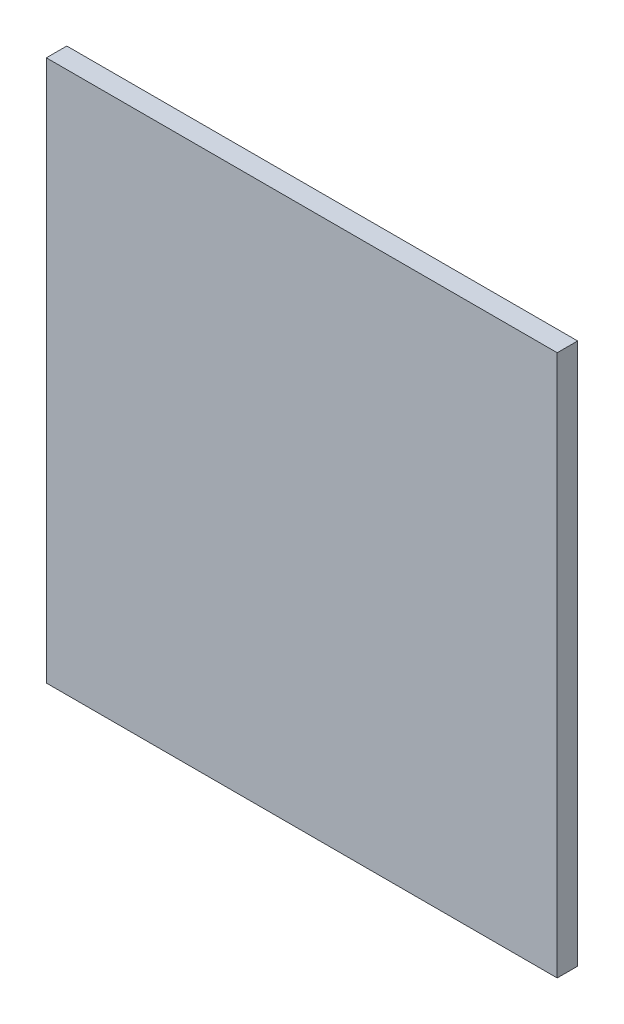
ISO-10303-21;
HEADER;
FILE_DESCRIPTION(('STEP AP214'),'2;1');
FILE_NAME('part.step','',(''),(''),'','','');
FILE_SCHEMA(('AUTOMOTIVE_DESIGN { 1 0 10303 214 1 1 1 1 }'));
ENDSEC;
DATA;
#1=APPLICATION_CONTEXT('core data for automotive mechanical design processes');
#2=APPLICATION_PROTOCOL_DEFINITION('international standard','automotive_design',2000,#1);
#3=PRODUCT_CONTEXT('',#1,'mechanical');
#4=PRODUCT('Part','Part','',(#3));
#5=PRODUCT_RELATED_PRODUCT_CATEGORY('part','',(#4));
#6=PRODUCT_DEFINITION_FORMATION('','',#4);
#7=PRODUCT_DEFINITION_CONTEXT('part definition',#1,'design');
#8=PRODUCT_DEFINITION('design','',#6,#7);
#9=PRODUCT_DEFINITION_SHAPE('','',#8);
#10=(LENGTH_UNIT() NAMED_UNIT(*) SI_UNIT(.MILLI.,.METRE.));
#11=(NAMED_UNIT(*) PLANE_ANGLE_UNIT() SI_UNIT($,.RADIAN.));
#12=(NAMED_UNIT(*) SI_UNIT($,.STERADIAN.) SOLID_ANGLE_UNIT());
#13=UNCERTAINTY_MEASURE_WITH_UNIT(LENGTH_MEASURE(1.E-05),#10,'distance_accuracy_value','');
#14=(GEOMETRIC_REPRESENTATION_CONTEXT(3) GLOBAL_UNCERTAINTY_ASSIGNED_CONTEXT((#13)) GLOBAL_UNIT_ASSIGNED_CONTEXT((#10,
#11,#12)) REPRESENTATION_CONTEXT('',''));
#15=CARTESIAN_POINT('',(0.,0.,0.));
#16=DIRECTION('',(0.,0.,1.));
#17=DIRECTION('',(1.,0.,0.));
#18=AXIS2_PLACEMENT_3D('',#15,#16,#17);
#19=CARTESIAN_POINT('',(250.,265.,20.));
#20=DIRECTION('',(-1.,0.,0.));
#21=DIRECTION('',(0.,-1.,0.));
#22=AXIS2_PLACEMENT_3D('',#19,#20,#21);
#23=PLANE('',#22);
#24=DIRECTION('',(0.,1.,0.));
#25=VECTOR('',#24,1.);
#26=CARTESIAN_POINT('',(250.,265.,0.));
#27=LINE('',#26,#25);
#28=CARTESIAN_POINT('',(250.,-265.,0.));
#29=VERTEX_POINT('',#28);
#30=CARTESIAN_POINT('',(250.,265.,0.));
#31=VERTEX_POINT('',#30);
#32=EDGE_CURVE('E100',#29,#31,#27,.T.);
#33=ORIENTED_EDGE('',*,*,#32,.T.);
#34=DIRECTION('',(0.,0.,-1.));
#35=VECTOR('',#34,1.);
#36=CARTESIAN_POINT('',(250.,265.,20.));
#37=LINE('',#36,#35);
#38=CARTESIAN_POINT('',(250.,265.,20.));
#39=VERTEX_POINT('',#38);
#40=EDGE_CURVE('E11',#39,#31,#37,.T.);
#41=ORIENTED_EDGE('',*,*,#40,.F.);
#42=DIRECTION('',(0.,1.,0.));
#43=VECTOR('',#42,1.);
#44=CARTESIAN_POINT('',(250.,265.,20.));
#45=LINE('',#44,#43);
#46=CARTESIAN_POINT('',(250.,-265.,20.));
#47=VERTEX_POINT('',#46);
#48=EDGE_CURVE('E88',#47,#39,#45,.T.);
#49=ORIENTED_EDGE('',*,*,#48,.F.);
#50=DIRECTION('',(0.,0.,-1.));
#51=VECTOR('',#50,1.);
#52=CARTESIAN_POINT('',(250.,-265.,20.));
#53=LINE('',#52,#51);
#54=EDGE_CURVE('E96',#47,#29,#53,.T.);
#55=ORIENTED_EDGE('',*,*,#54,.T.);
#56=EDGE_LOOP('',(#33,#41,#49,#55));
#57=FACE_BOUND('',#56,.T.);
#58=ADVANCED_FACE('F37',(#57),#23,.F.);
#59=CARTESIAN_POINT('',(-250.,265.,20.));
#60=DIRECTION('',(0.,-1.,0.));
#61=DIRECTION('',(0.,0.,-1.));
#62=AXIS2_PLACEMENT_3D('',#59,#60,#61);
#63=PLANE('',#62);
#64=DIRECTION('',(-1.,0.,0.));
#65=VECTOR('',#64,1.);
#66=CARTESIAN_POINT('',(-250.,265.,0.));
#67=LINE('',#66,#65);
#68=CARTESIAN_POINT('',(-250.,265.,0.));
#69=VERTEX_POINT('',#68);
#70=EDGE_CURVE('E92',#31,#69,#67,.T.);
#71=ORIENTED_EDGE('',*,*,#70,.T.);
#72=DIRECTION('',(0.,0.,-1.));
#73=VECTOR('',#72,1.);
#74=CARTESIAN_POINT('',(-250.,265.,20.));
#75=LINE('',#74,#73);
#76=CARTESIAN_POINT('',(-250.,265.,20.));
#77=VERTEX_POINT('',#76);
#78=EDGE_CURVE('E45',#77,#69,#75,.T.);
#79=ORIENTED_EDGE('',*,*,#78,.F.);
#80=DIRECTION('',(-1.,0.,0.));
#81=VECTOR('',#80,1.);
#82=CARTESIAN_POINT('',(-250.,265.,20.));
#83=LINE('',#82,#81);
#84=EDGE_CURVE('E83',#39,#77,#83,.T.);
#85=ORIENTED_EDGE('',*,*,#84,.F.);
#86=ORIENTED_EDGE('',*,*,#40,.T.);
#87=EDGE_LOOP('',(#71,#79,#85,#86));
#88=FACE_BOUND('',#87,.T.);
#89=ADVANCED_FACE('F91',(#88),#63,.F.);
#90=CARTESIAN_POINT('',(-250.,265.,20.));
#91=DIRECTION('',(1.,0.,0.));
#92=DIRECTION('',(0.,1.,0.));
#93=AXIS2_PLACEMENT_3D('',#90,#91,#92);
#94=PLANE('',#93);
#95=DIRECTION('',(0.,-1.,0.));
#96=VECTOR('',#95,1.);
#97=CARTESIAN_POINT('',(-250.,265.,0.));
#98=LINE('',#97,#96);
#99=CARTESIAN_POINT('',(-250.,-265.,0.));
#100=VERTEX_POINT('',#99);
#101=EDGE_CURVE('E70',#69,#100,#98,.T.);
#102=ORIENTED_EDGE('',*,*,#101,.T.);
#103=DIRECTION('',(0.,0.,-1.));
#104=VECTOR('',#103,1.);
#105=CARTESIAN_POINT('',(-250.,-265.,20.));
#106=LINE('',#105,#104);
#107=CARTESIAN_POINT('',(-250.,-265.,20.));
#108=VERTEX_POINT('',#107);
#109=EDGE_CURVE('E93',#108,#100,#106,.T.);
#110=ORIENTED_EDGE('',*,*,#109,.F.);
#111=DIRECTION('',(0.,-1.,0.));
#112=VECTOR('',#111,1.);
#113=CARTESIAN_POINT('',(-250.,265.,20.));
#114=LINE('',#113,#112);
#115=EDGE_CURVE('E86',#77,#108,#114,.T.);
#116=ORIENTED_EDGE('',*,*,#115,.F.);
#117=ORIENTED_EDGE('',*,*,#78,.T.);
#118=EDGE_LOOP('',(#102,#110,#116,#117));
#119=FACE_BOUND('',#118,.T.);
#120=ADVANCED_FACE('F94',(#119),#94,.F.);
#121=CARTESIAN_POINT('',(-250.,-265.,20.));
#122=DIRECTION('',(0.,1.,0.));
#123=DIRECTION('',(0.,0.,1.));
#124=AXIS2_PLACEMENT_3D('',#121,#122,#123);
#125=PLANE('',#124);
#126=DIRECTION('',(1.,0.,0.));
#127=VECTOR('',#126,1.);
#128=CARTESIAN_POINT('',(-250.,-265.,0.));
#129=LINE('',#128,#127);
#130=EDGE_CURVE('E76',#100,#29,#129,.T.);
#131=ORIENTED_EDGE('',*,*,#130,.T.);
#132=ORIENTED_EDGE('',*,*,#54,.F.);
#133=DIRECTION('',(1.,0.,0.));
#134=VECTOR('',#133,1.);
#135=CARTESIAN_POINT('',(-250.,-265.,20.));
#136=LINE('',#135,#134);
#137=EDGE_CURVE('E53',#108,#47,#136,.T.);
#138=ORIENTED_EDGE('',*,*,#137,.F.);
#139=ORIENTED_EDGE('',*,*,#109,.T.);
#140=EDGE_LOOP('',(#131,#132,#138,#139));
#141=FACE_BOUND('',#140,.T.);
#142=ADVANCED_FACE('F107',(#141),#125,.F.);
#143=CARTESIAN_POINT('',(0.,0.,20.));
#144=DIRECTION('',(0.,0.,1.));
#145=DIRECTION('',(1.,0.,0.));
#146=AXIS2_PLACEMENT_3D('',#143,#144,#145);
#147=PLANE('',#146);
#148=ORIENTED_EDGE('',*,*,#48,.T.);
#149=ORIENTED_EDGE('',*,*,#84,.T.);
#150=ORIENTED_EDGE('',*,*,#115,.T.);
#151=ORIENTED_EDGE('',*,*,#137,.T.);
#152=EDGE_LOOP('',(#148,#149,#150,#151));
#153=FACE_BOUND('',#152,.T.);
#154=ADVANCED_FACE('F84',(#153),#147,.T.);
#155=CARTESIAN_POINT('',(0.,0.,0.));
#156=DIRECTION('',(0.,0.,1.));
#157=DIRECTION('',(1.,0.,0.));
#158=AXIS2_PLACEMENT_3D('',#155,#156,#157);
#159=PLANE('',#158);
#160=ORIENTED_EDGE('',*,*,#32,.F.);
#161=ORIENTED_EDGE('',*,*,#130,.F.);
#162=ORIENTED_EDGE('',*,*,#101,.F.);
#163=ORIENTED_EDGE('',*,*,#70,.F.);
#164=EDGE_LOOP('',(#160,#161,#162,#163));
#165=FACE_BOUND('',#164,.T.);
#166=ADVANCED_FACE('F110',(#165),#159,.F.);
#167=CLOSED_SHELL('',(#58,#89,#120,#142,#154,#166));
#168=MANIFOLD_SOLID_BREP('B2',#167);
#169=ADVANCED_BREP_SHAPE_REPRESENTATION('',(#18,#168),#14);
#170=SHAPE_DEFINITION_REPRESENTATION(#9,#169);
ENDSEC;
END-ISO-10303-21;
